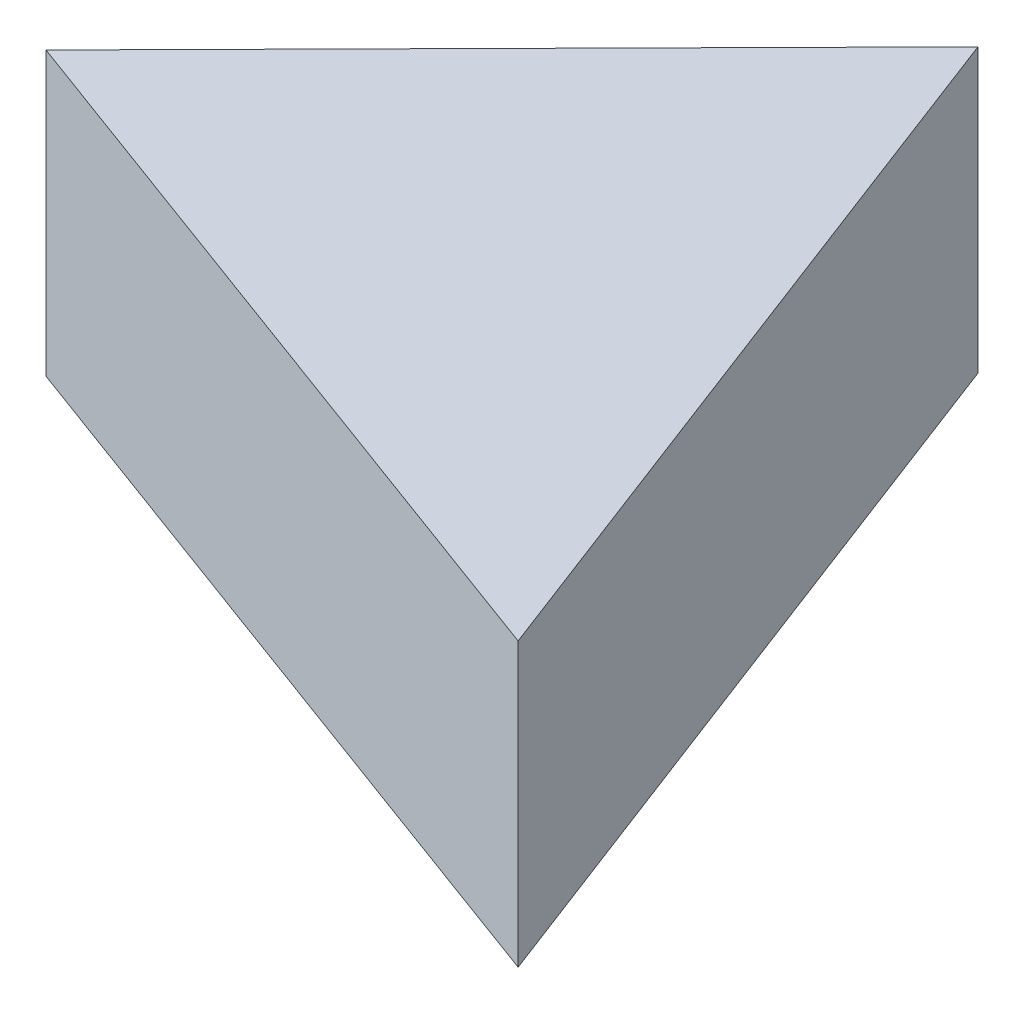
ISO-10303-21;
HEADER;
FILE_DESCRIPTION(('STEP AP214'),'2;1');
FILE_NAME('part.step','',(''),(''),'','','');
FILE_SCHEMA(('AUTOMOTIVE_DESIGN { 1 0 10303 214 1 1 1 1 }'));
ENDSEC;
DATA;
#1=APPLICATION_CONTEXT('core data for automotive mechanical design processes');
#2=APPLICATION_PROTOCOL_DEFINITION('international standard','automotive_design',2000,#1);
#3=PRODUCT_CONTEXT('',#1,'mechanical');
#4=PRODUCT('Part','Part','',(#3));
#5=PRODUCT_RELATED_PRODUCT_CATEGORY('part','',(#4));
#6=PRODUCT_DEFINITION_FORMATION('','',#4);
#7=PRODUCT_DEFINITION_CONTEXT('part definition',#1,'design');
#8=PRODUCT_DEFINITION('design','',#6,#7);
#9=PRODUCT_DEFINITION_SHAPE('','',#8);
#10=(LENGTH_UNIT() NAMED_UNIT(*) SI_UNIT(.MILLI.,.METRE.));
#11=(NAMED_UNIT(*) PLANE_ANGLE_UNIT() SI_UNIT($,.RADIAN.));
#12=(NAMED_UNIT(*) SI_UNIT($,.STERADIAN.) SOLID_ANGLE_UNIT());
#13=UNCERTAINTY_MEASURE_WITH_UNIT(LENGTH_MEASURE(1.E-05),#10,'distance_accuracy_value','');
#14=(GEOMETRIC_REPRESENTATION_CONTEXT(3) GLOBAL_UNCERTAINTY_ASSIGNED_CONTEXT((#13)) GLOBAL_UNIT_ASSIGNED_CONTEXT((#10,
#11,#12)) REPRESENTATION_CONTEXT('',''));
#15=CARTESIAN_POINT('',(0.,0.,0.));
#16=DIRECTION('',(0.,0.,1.));
#17=DIRECTION('',(1.,0.,0.));
#18=AXIS2_PLACEMENT_3D('',#15,#16,#17);
#19=CARTESIAN_POINT('',(46.3748925777009,34.,56.2102106572635));
#20=DIRECTION('',(-0.934075513407373,0.,0.357075531579457));
#21=DIRECTION('',(0.357075531579457,0.,0.934075513407373));
#22=AXIS2_PLACEMENT_3D('',#19,#20,#21);
#23=PLANE('',#22);
#24=DIRECTION('',(-0.357075531579457,0.,-0.934075513407373));
#25=VECTOR('',#24,1.);
#26=CARTESIAN_POINT('',(46.3748925777009,0.,56.2102106572635));
#27=LINE('',#26,#25);
#28=CARTESIAN_POINT('',(46.3748925777009,0.,56.2102106572635));
#29=VERTEX_POINT('',#28);
#30=CARTESIAN_POINT('',(12.1270973659031,0.,-33.3787532071285));
#31=VERTEX_POINT('',#30);
#32=EDGE_CURVE('E79',#29,#31,#27,.T.);
#33=ORIENTED_EDGE('',*,*,#32,.T.);
#34=DIRECTION('',(0.,-1.,0.));
#35=VECTOR('',#34,1.);
#36=CARTESIAN_POINT('',(12.1270973659031,34.,-33.3787532071285));
#37=LINE('',#36,#35);
#38=CARTESIAN_POINT('',(12.1270973659031,34.,-33.3787532071285));
#39=VERTEX_POINT('',#38);
#40=EDGE_CURVE('E11',#39,#31,#37,.T.);
#41=ORIENTED_EDGE('',*,*,#40,.F.);
#42=DIRECTION('',(-0.357075531579457,0.,-0.934075513407373));
#43=VECTOR('',#42,1.);
#44=CARTESIAN_POINT('',(46.3748925777009,34.,56.2102106572635));
#45=LINE('',#44,#43);
#46=CARTESIAN_POINT('',(46.3748925777009,34.,56.2102106572635));
#47=VERTEX_POINT('',#46);
#48=EDGE_CURVE('E72',#47,#39,#45,.T.);
#49=ORIENTED_EDGE('',*,*,#48,.F.);
#50=DIRECTION('',(0.,-1.,0.));
#51=VECTOR('',#50,1.);
#52=CARTESIAN_POINT('',(46.3748925777009,34.,56.2102106572635));
#53=LINE('',#52,#51);
#54=EDGE_CURVE('E80',#47,#29,#53,.T.);
#55=ORIENTED_EDGE('',*,*,#54,.T.);
#56=EDGE_LOOP('',(#33,#41,#49,#55));
#57=FACE_BOUND('',#56,.T.);
#58=ADVANCED_FACE('F32',(#57),#23,.F.);
#59=CARTESIAN_POINT('',(12.1270973659031,34.,-33.3787532071285));
#60=DIRECTION('',(0.711303149200116,0.,0.702885360452185));
#61=DIRECTION('',(0.702885360452185,0.,-0.711303149200116));
#62=AXIS2_PLACEMENT_3D('',#59,#60,#61);
#63=PLANE('',#62);
#64=DIRECTION('',(-0.702885360452185,0.,0.711303149200116));
#65=VECTOR('',#64,1.);
#66=CARTESIAN_POINT('',(12.1270973659031,0.,-33.3787532071285));
#67=LINE('',#66,#65);
#68=CARTESIAN_POINT('',(-43.6154204900014,0.,23.0313397129187));
#69=VERTEX_POINT('',#68);
#70=EDGE_CURVE('E60',#31,#69,#67,.T.);
#71=ORIENTED_EDGE('',*,*,#70,.T.);
#72=DIRECTION('',(0.,-1.,0.));
#73=VECTOR('',#72,1.);
#74=CARTESIAN_POINT('',(-43.6154204900014,34.,23.0313397129187));
#75=LINE('',#74,#73);
#76=CARTESIAN_POINT('',(-43.6154204900014,34.,23.0313397129187));
#77=VERTEX_POINT('',#76);
#78=EDGE_CURVE('E40',#77,#69,#75,.T.);
#79=ORIENTED_EDGE('',*,*,#78,.F.);
#80=DIRECTION('',(-0.702885360452185,0.,0.711303149200116));
#81=VECTOR('',#80,1.);
#82=CARTESIAN_POINT('',(12.1270973659031,34.,-33.3787532071285));
#83=LINE('',#82,#81);
#84=EDGE_CURVE('E68',#39,#77,#83,.T.);
#85=ORIENTED_EDGE('',*,*,#84,.F.);
#86=ORIENTED_EDGE('',*,*,#40,.T.);
#87=EDGE_LOOP('',(#71,#79,#85,#86));
#88=FACE_BOUND('',#87,.T.);
#89=ADVANCED_FACE('F69',(#88),#63,.F.);
#90=CARTESIAN_POINT('',(-43.6154204900014,34.,23.0313397129187));
#91=DIRECTION('',(0.345930676891485,0.,-0.938260074172081));
#92=DIRECTION('',(-0.938260074172081,0.,-0.345930676891485));
#93=AXIS2_PLACEMENT_3D('',#90,#91,#92);
#94=PLANE('',#93);
#95=DIRECTION('',(0.938260074172081,0.,0.345930676891485));
#96=VECTOR('',#95,1.);
#97=CARTESIAN_POINT('',(-43.6154204900014,0.,23.0313397129187));
#98=LINE('',#97,#96);
#99=EDGE_CURVE('E65',#69,#29,#98,.T.);
#100=ORIENTED_EDGE('',*,*,#99,.T.);
#101=ORIENTED_EDGE('',*,*,#54,.F.);
#102=DIRECTION('',(0.938260074172081,0.,0.345930676891485));
#103=VECTOR('',#102,1.);
#104=CARTESIAN_POINT('',(-43.6154204900014,34.,23.0313397129187));
#105=LINE('',#104,#103);
#106=EDGE_CURVE('E48',#77,#47,#105,.T.);
#107=ORIENTED_EDGE('',*,*,#106,.F.);
#108=ORIENTED_EDGE('',*,*,#78,.T.);
#109=EDGE_LOOP('',(#100,#101,#107,#108));
#110=FACE_BOUND('',#109,.T.);
#111=ADVANCED_FACE('F87',(#110),#94,.F.);
#112=CARTESIAN_POINT('',(12.1270973659031,34.,-33.3787532071285));
#113=DIRECTION('',(0.,1.,0.));
#114=DIRECTION('',(0.,0.,1.));
#115=AXIS2_PLACEMENT_3D('',#112,#113,#114);
#116=PLANE('',#115);
#117=ORIENTED_EDGE('',*,*,#48,.T.);
#118=ORIENTED_EDGE('',*,*,#84,.T.);
#119=ORIENTED_EDGE('',*,*,#106,.T.);
#120=EDGE_LOOP('',(#117,#118,#119));
#121=FACE_BOUND('',#120,.T.);
#122=ADVANCED_FACE('F75',(#121),#116,.T.);
#123=CARTESIAN_POINT('',(12.1270973659031,0.,-33.3787532071285));
#124=DIRECTION('',(0.,1.,0.));
#125=DIRECTION('',(0.,0.,1.));
#126=AXIS2_PLACEMENT_3D('',#123,#124,#125);
#127=PLANE('',#126);
#128=ORIENTED_EDGE('',*,*,#32,.F.);
#129=ORIENTED_EDGE('',*,*,#99,.F.);
#130=ORIENTED_EDGE('',*,*,#70,.F.);
#131=EDGE_LOOP('',(#128,#129,#130));
#132=FACE_BOUND('',#131,.T.);
#133=ADVANCED_FACE('F88',(#132),#127,.F.);
#134=CLOSED_SHELL('',(#58,#89,#111,#122,#133));
#135=MANIFOLD_SOLID_BREP('B2',#134);
#136=ADVANCED_BREP_SHAPE_REPRESENTATION('',(#18,#135),#14);
#137=SHAPE_DEFINITION_REPRESENTATION(#9,#136);
ENDSEC;
END-ISO-10303-21;
